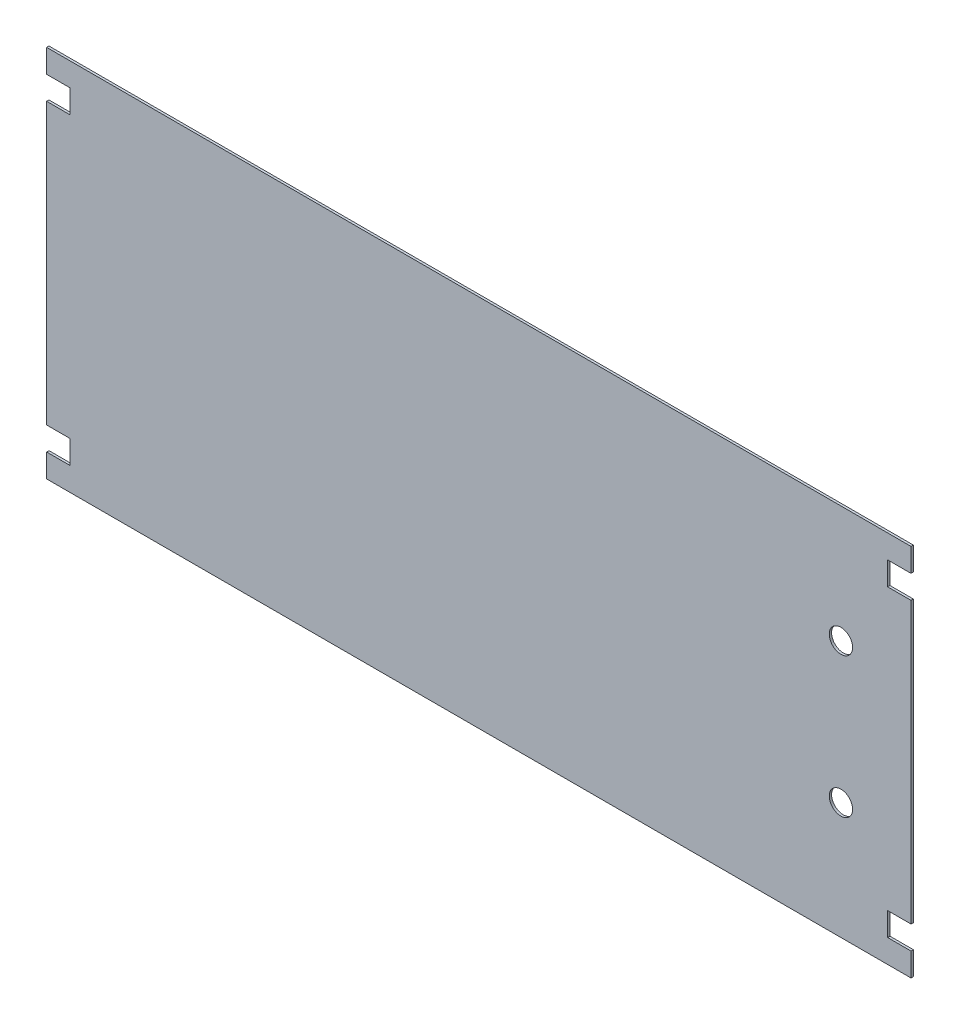
ISO-10303-21;
HEADER;
FILE_DESCRIPTION(('STEP AP214'),'2;1');
FILE_NAME('part.step','',(''),(''),'','','');
FILE_SCHEMA(('AUTOMOTIVE_DESIGN { 1 0 10303 214 1 1 1 1 }'));
ENDSEC;
DATA;
#1=APPLICATION_CONTEXT('core data for automotive mechanical design processes');
#2=APPLICATION_PROTOCOL_DEFINITION('international standard','automotive_design',2000,#1);
#3=PRODUCT_CONTEXT('',#1,'mechanical');
#4=PRODUCT('Part','Part','',(#3));
#5=PRODUCT_RELATED_PRODUCT_CATEGORY('part','',(#4));
#6=PRODUCT_DEFINITION_FORMATION('','',#4);
#7=PRODUCT_DEFINITION_CONTEXT('part definition',#1,'design');
#8=PRODUCT_DEFINITION('design','',#6,#7);
#9=PRODUCT_DEFINITION_SHAPE('','',#8);
#10=(LENGTH_UNIT() NAMED_UNIT(*) SI_UNIT(.MILLI.,.METRE.));
#11=(NAMED_UNIT(*) PLANE_ANGLE_UNIT() SI_UNIT($,.RADIAN.));
#12=(NAMED_UNIT(*) SI_UNIT($,.STERADIAN.) SOLID_ANGLE_UNIT());
#13=UNCERTAINTY_MEASURE_WITH_UNIT(LENGTH_MEASURE(1.E-05),#10,'distance_accuracy_value','');
#14=(GEOMETRIC_REPRESENTATION_CONTEXT(3) GLOBAL_UNCERTAINTY_ASSIGNED_CONTEXT((#13)) GLOBAL_UNIT_ASSIGNED_CONTEXT((#10,
#11,#12)) REPRESENTATION_CONTEXT('',''));
#15=CARTESIAN_POINT('',(0.,0.,0.));
#16=DIRECTION('',(0.,0.,1.));
#17=DIRECTION('',(1.,0.,0.));
#18=AXIS2_PLACEMENT_3D('',#15,#16,#17);
#19=CARTESIAN_POINT('',(0.,0.,1.));
#20=DIRECTION('',(1.,0.,0.));
#21=DIRECTION('',(0.,0.,-1.));
#22=AXIS2_PLACEMENT_3D('',#19,#20,#21);
#23=PLANE('',#22);
#24=DIRECTION('',(0.,-1.,0.));
#25=VECTOR('',#24,1.);
#26=CARTESIAN_POINT('',(0.,0.,0.));
#27=LINE('',#26,#25);
#28=CARTESIAN_POINT('',(0.,140.,0.));
#29=VERTEX_POINT('',#28);
#30=CARTESIAN_POINT('',(0.,20.,0.));
#31=VERTEX_POINT('',#30);
#32=EDGE_CURVE('E317',#29,#31,#27,.T.);
#33=ORIENTED_EDGE('',*,*,#32,.T.);
#34=DIRECTION('',(0.,0.,1.));
#35=VECTOR('',#34,1.);
#36=CARTESIAN_POINT('',(1.36167772214882E-12,20.,-0.000999999999999916));
#37=LINE('',#36,#35);
#38=CARTESIAN_POINT('',(1.36167772214882E-12,20.,1.));
#39=VERTEX_POINT('',#38);
#40=EDGE_CURVE('E272',#31,#39,#37,.T.);
#41=ORIENTED_EDGE('',*,*,#40,.T.);
#42=DIRECTION('',(0.,-1.,0.));
#43=VECTOR('',#42,1.);
#44=CARTESIAN_POINT('',(0.,0.,1.));
#45=LINE('',#44,#43);
#46=CARTESIAN_POINT('',(0.,140.,1.));
#47=VERTEX_POINT('',#46);
#48=EDGE_CURVE('E310',#47,#39,#45,.T.);
#49=ORIENTED_EDGE('',*,*,#48,.F.);
#50=DIRECTION('',(0.,0.,1.));
#51=VECTOR('',#50,1.);
#52=CARTESIAN_POINT('',(0.,140.,-0.000999999999999916));
#53=LINE('',#52,#51);
#54=EDGE_CURVE('E293',#29,#47,#53,.T.);
#55=ORIENTED_EDGE('',*,*,#54,.F.);
#56=EDGE_LOOP('',(#33,#41,#49,#55));
#57=FACE_BOUND('',#56,.T.);
#58=ADVANCED_FACE('F36',(#57),#23,.F.);
#59=CARTESIAN_POINT('',(0.,160.,0.));
#60=VERTEX_POINT('',#59);
#61=CARTESIAN_POINT('',(0.,150.,0.));
#62=VERTEX_POINT('',#61);
#63=EDGE_CURVE('E315',#60,#62,#27,.T.);
#64=ORIENTED_EDGE('',*,*,#63,.T.);
#65=DIRECTION('',(0.,0.,1.));
#66=VECTOR('',#65,1.);
#67=CARTESIAN_POINT('',(0.,150.,-0.000999999999999916));
#68=LINE('',#67,#66);
#69=CARTESIAN_POINT('',(0.,150.,1.));
#70=VERTEX_POINT('',#69);
#71=EDGE_CURVE('E294',#62,#70,#68,.T.);
#72=ORIENTED_EDGE('',*,*,#71,.T.);
#73=CARTESIAN_POINT('',(0.,160.,1.));
#74=VERTEX_POINT('',#73);
#75=EDGE_CURVE('E306',#74,#70,#45,.T.);
#76=ORIENTED_EDGE('',*,*,#75,.F.);
#77=DIRECTION('',(0.,0.,-1.));
#78=VECTOR('',#77,1.);
#79=CARTESIAN_POINT('',(0.,160.,1.));
#80=LINE('',#79,#78);
#81=EDGE_CURVE('E212',#74,#60,#80,.T.);
#82=ORIENTED_EDGE('',*,*,#81,.T.);
#83=EDGE_LOOP('',(#64,#72,#76,#82));
#84=FACE_BOUND('',#83,.T.);
#85=ADVANCED_FACE('F358',(#84),#23,.F.);
#86=CARTESIAN_POINT('',(370.,0.,1.));
#87=DIRECTION('',(-1.,0.,0.));
#88=DIRECTION('',(0.,0.,1.));
#89=AXIS2_PLACEMENT_3D('',#86,#87,#88);
#90=PLANE('',#89);
#91=DIRECTION('',(0.,1.,0.));
#92=VECTOR('',#91,1.);
#93=CARTESIAN_POINT('',(370.,0.,1.));
#94=LINE('',#93,#92);
#95=CARTESIAN_POINT('',(370.000000000001,20.,1.));
#96=VERTEX_POINT('',#95);
#97=CARTESIAN_POINT('',(370.,140.,1.));
#98=VERTEX_POINT('',#97);
#99=EDGE_CURVE('E314',#96,#98,#94,.T.);
#100=ORIENTED_EDGE('',*,*,#99,.F.);
#101=DIRECTION('',(0.,0.,1.));
#102=VECTOR('',#101,1.);
#103=CARTESIAN_POINT('',(370.000000000001,20.,-0.000999999999999916));
#104=LINE('',#103,#102);
#105=CARTESIAN_POINT('',(370.,20.,0.));
#106=VERTEX_POINT('',#105);
#107=EDGE_CURVE('E200',#106,#96,#104,.T.);
#108=ORIENTED_EDGE('',*,*,#107,.F.);
#109=DIRECTION('',(0.,1.,0.));
#110=VECTOR('',#109,1.);
#111=CARTESIAN_POINT('',(370.,0.,0.));
#112=LINE('',#111,#110);
#113=CARTESIAN_POINT('',(370.,140.,0.));
#114=VERTEX_POINT('',#113);
#115=EDGE_CURVE('E192',#106,#114,#112,.T.);
#116=ORIENTED_EDGE('',*,*,#115,.T.);
#117=DIRECTION('',(0.,0.,1.));
#118=VECTOR('',#117,1.);
#119=CARTESIAN_POINT('',(370.,140.,-0.000999999999999916));
#120=LINE('',#119,#118);
#121=EDGE_CURVE('E173',#114,#98,#120,.T.);
#122=ORIENTED_EDGE('',*,*,#121,.T.);
#123=EDGE_LOOP('',(#100,#108,#116,#122));
#124=FACE_BOUND('',#123,.T.);
#125=ADVANCED_FACE('F199',(#124),#90,.F.);
#126=CARTESIAN_POINT('',(370.,150.,1.));
#127=VERTEX_POINT('',#126);
#128=CARTESIAN_POINT('',(370.,160.,1.));
#129=VERTEX_POINT('',#128);
#130=EDGE_CURVE('E312',#127,#129,#94,.T.);
#131=ORIENTED_EDGE('',*,*,#130,.F.);
#132=DIRECTION('',(0.,0.,1.));
#133=VECTOR('',#132,1.);
#134=CARTESIAN_POINT('',(370.,150.,-0.000999999999999916));
#135=LINE('',#134,#133);
#136=CARTESIAN_POINT('',(370.,150.,0.));
#137=VERTEX_POINT('',#136);
#138=EDGE_CURVE('E184',#137,#127,#135,.T.);
#139=ORIENTED_EDGE('',*,*,#138,.F.);
#140=CARTESIAN_POINT('',(370.,160.,0.));
#141=VERTEX_POINT('',#140);
#142=EDGE_CURVE('E202',#137,#141,#112,.T.);
#143=ORIENTED_EDGE('',*,*,#142,.T.);
#144=DIRECTION('',(0.,0.,-1.));
#145=VECTOR('',#144,1.);
#146=CARTESIAN_POINT('',(370.,160.,1.));
#147=LINE('',#146,#145);
#148=EDGE_CURVE('E215',#129,#141,#147,.T.);
#149=ORIENTED_EDGE('',*,*,#148,.F.);
#150=EDGE_LOOP('',(#131,#139,#143,#149));
#151=FACE_BOUND('',#150,.T.);
#152=ADVANCED_FACE('F366',(#151),#90,.F.);
#153=CARTESIAN_POINT('',(1.36290236894797E-12,9.99999999999998,1.));
#154=VERTEX_POINT('',#153);
#155=CARTESIAN_POINT('',(0.,0.,1.));
#156=VERTEX_POINT('',#155);
#157=EDGE_CURVE('E211',#154,#156,#45,.T.);
#158=ORIENTED_EDGE('',*,*,#157,.F.);
#159=DIRECTION('',(0.,0.,1.));
#160=VECTOR('',#159,1.);
#161=CARTESIAN_POINT('',(1.36290236894797E-12,9.99999999999998,-0.000999999999999916));
#162=LINE('',#161,#160);
#163=CARTESIAN_POINT('',(1.36290236894797E-12,9.99999999999998,0.));
#164=VERTEX_POINT('',#163);
#165=EDGE_CURVE('E275',#164,#154,#162,.T.);
#166=ORIENTED_EDGE('',*,*,#165,.F.);
#167=CARTESIAN_POINT('',(0.,0.,0.));
#168=VERTEX_POINT('',#167);
#169=EDGE_CURVE('E305',#164,#168,#27,.T.);
#170=ORIENTED_EDGE('',*,*,#169,.T.);
#171=DIRECTION('',(0.,0.,-1.));
#172=VECTOR('',#171,1.);
#173=CARTESIAN_POINT('',(0.,0.,1.));
#174=LINE('',#173,#172);
#175=EDGE_CURVE('E11',#156,#168,#174,.T.);
#176=ORIENTED_EDGE('',*,*,#175,.F.);
#177=EDGE_LOOP('',(#158,#166,#170,#176));
#178=FACE_BOUND('',#177,.T.);
#179=ADVANCED_FACE('F38',(#178),#23,.F.);
#180=CARTESIAN_POINT('',(0.,0.,1.));
#181=DIRECTION('',(0.,1.,0.));
#182=DIRECTION('',(0.,0.,1.));
#183=AXIS2_PLACEMENT_3D('',#180,#181,#182);
#184=PLANE('',#183);
#185=DIRECTION('',(1.,0.,0.));
#186=VECTOR('',#185,1.);
#187=CARTESIAN_POINT('',(0.,0.,0.));
#188=LINE('',#187,#186);
#189=CARTESIAN_POINT('',(370.,0.,0.));
#190=VERTEX_POINT('',#189);
#191=EDGE_CURVE('E206',#168,#190,#188,.T.);
#192=ORIENTED_EDGE('',*,*,#191,.T.);
#193=DIRECTION('',(0.,0.,-1.));
#194=VECTOR('',#193,1.);
#195=CARTESIAN_POINT('',(370.,0.,1.));
#196=LINE('',#195,#194);
#197=CARTESIAN_POINT('',(370.,0.,1.));
#198=VERTEX_POINT('',#197);
#199=EDGE_CURVE('E44',#198,#190,#196,.T.);
#200=ORIENTED_EDGE('',*,*,#199,.F.);
#201=DIRECTION('',(1.,0.,0.));
#202=VECTOR('',#201,1.);
#203=CARTESIAN_POINT('',(0.,0.,1.));
#204=LINE('',#203,#202);
#205=EDGE_CURVE('E309',#156,#198,#204,.T.);
#206=ORIENTED_EDGE('',*,*,#205,.F.);
#207=ORIENTED_EDGE('',*,*,#175,.T.);
#208=EDGE_LOOP('',(#192,#200,#206,#207));
#209=FACE_BOUND('',#208,.T.);
#210=ADVANCED_FACE('F418',(#209),#184,.F.);
#211=CARTESIAN_POINT('',(370.,9.99999999999998,0.));
#212=VERTEX_POINT('',#211);
#213=EDGE_CURVE('E201',#190,#212,#112,.T.);
#214=ORIENTED_EDGE('',*,*,#213,.T.);
#215=DIRECTION('',(0.,0.,1.));
#216=VECTOR('',#215,1.);
#217=CARTESIAN_POINT('',(370.000000000001,9.99999999999998,-0.000999999999999916));
#218=LINE('',#217,#216);
#219=CARTESIAN_POINT('',(370.000000000001,9.99999999999998,1.));
#220=VERTEX_POINT('',#219);
#221=EDGE_CURVE('E252',#212,#220,#218,.T.);
#222=ORIENTED_EDGE('',*,*,#221,.T.);
#223=EDGE_CURVE('E226',#198,#220,#94,.T.);
#224=ORIENTED_EDGE('',*,*,#223,.F.);
#225=ORIENTED_EDGE('',*,*,#199,.T.);
#226=EDGE_LOOP('',(#214,#222,#224,#225));
#227=FACE_BOUND('',#226,.T.);
#228=ADVANCED_FACE('F223',(#227),#90,.F.);
#229=CARTESIAN_POINT('',(0.,160.,1.));
#230=DIRECTION('',(0.,-1.,0.));
#231=DIRECTION('',(0.,0.,-1.));
#232=AXIS2_PLACEMENT_3D('',#229,#230,#231);
#233=PLANE('',#232);
#234=DIRECTION('',(-1.,0.,0.));
#235=VECTOR('',#234,1.);
#236=CARTESIAN_POINT('',(0.,160.,0.));
#237=LINE('',#236,#235);
#238=EDGE_CURVE('E205',#141,#60,#237,.T.);
#239=ORIENTED_EDGE('',*,*,#238,.T.);
#240=ORIENTED_EDGE('',*,*,#81,.F.);
#241=DIRECTION('',(-1.,0.,0.));
#242=VECTOR('',#241,1.);
#243=CARTESIAN_POINT('',(0.,160.,1.));
#244=LINE('',#243,#242);
#245=EDGE_CURVE('E216',#129,#74,#244,.T.);
#246=ORIENTED_EDGE('',*,*,#245,.F.);
#247=ORIENTED_EDGE('',*,*,#148,.T.);
#248=EDGE_LOOP('',(#239,#240,#246,#247));
#249=FACE_BOUND('',#248,.T.);
#250=ADVANCED_FACE('F354',(#249),#233,.F.);
#251=CARTESIAN_POINT('',(0.,0.,1.));
#252=DIRECTION('',(0.,0.,-1.));
#253=DIRECTION('',(-1.,0.,0.));
#254=AXIS2_PLACEMENT_3D('',#251,#252,#253);
#255=PLANE('',#254);
#256=CARTESIAN_POINT('',(340.000000000001,110.,1.));
#257=DIRECTION('',(0.,0.,1.));
#258=DIRECTION('',(1.,0.,0.));
#259=AXIS2_PLACEMENT_3D('',#256,#257,#258);
#260=CIRCLE('',#259,4.99999999999999);
#261=CARTESIAN_POINT('',(345.000000000001,110.,1.));
#262=VERTEX_POINT('',#261);
#263=EDGE_CURVE('E261',#262,#262,#260,.T.);
#264=ORIENTED_EDGE('',*,*,#263,.F.);
#265=EDGE_LOOP('',(#264));
#266=FACE_BOUND('',#265,.T.);
#267=CARTESIAN_POINT('',(340.000000000002,50.,1.));
#268=DIRECTION('',(0.,0.,1.));
#269=DIRECTION('',(1.,0.,0.));
#270=AXIS2_PLACEMENT_3D('',#267,#268,#269);
#271=CIRCLE('',#270,4.99999999999999);
#272=CARTESIAN_POINT('',(345.000000000002,50.,1.));
#273=VERTEX_POINT('',#272);
#274=EDGE_CURVE('E383',#273,#273,#271,.T.);
#275=ORIENTED_EDGE('',*,*,#274,.F.);
#276=EDGE_LOOP('',(#275));
#277=FACE_BOUND('',#276,.T.);
#278=ORIENTED_EDGE('',*,*,#48,.T.);
#279=DIRECTION('',(-1.,0.,0.));
#280=VECTOR('',#279,1.);
#281=CARTESIAN_POINT('',(1.36167772214882E-12,20.,1.));
#282=LINE('',#281,#280);
#283=CARTESIAN_POINT('',(10.0000000000014,20.,1.));
#284=VERTEX_POINT('',#283);
#285=EDGE_CURVE('E266',#284,#39,#282,.T.);
#286=ORIENTED_EDGE('',*,*,#285,.F.);
#287=DIRECTION('',(0.,1.,0.));
#288=VECTOR('',#287,1.);
#289=CARTESIAN_POINT('',(10.0000000000014,20.,1.));
#290=LINE('',#289,#288);
#291=CARTESIAN_POINT('',(10.0000000000014,9.99999999999998,1.));
#292=VERTEX_POINT('',#291);
#293=EDGE_CURVE('E270',#292,#284,#290,.T.);
#294=ORIENTED_EDGE('',*,*,#293,.F.);
#295=DIRECTION('',(1.,0.,0.));
#296=VECTOR('',#295,1.);
#297=CARTESIAN_POINT('',(1.36290236894797E-12,9.99999999999998,1.));
#298=LINE('',#297,#296);
#299=EDGE_CURVE('E268',#154,#292,#298,.T.);
#300=ORIENTED_EDGE('',*,*,#299,.F.);
#301=ORIENTED_EDGE('',*,*,#157,.T.);
#302=ORIENTED_EDGE('',*,*,#205,.T.);
#303=ORIENTED_EDGE('',*,*,#223,.T.);
#304=DIRECTION('',(1.,0.,0.));
#305=VECTOR('',#304,1.);
#306=CARTESIAN_POINT('',(360.000000000001,9.99999999999998,1.));
#307=LINE('',#306,#305);
#308=CARTESIAN_POINT('',(360.000000000001,9.99999999999998,1.));
#309=VERTEX_POINT('',#308);
#310=EDGE_CURVE('E248',#309,#220,#307,.T.);
#311=ORIENTED_EDGE('',*,*,#310,.F.);
#312=DIRECTION('',(0.,-1.,0.));
#313=VECTOR('',#312,1.);
#314=CARTESIAN_POINT('',(360.000000000001,20.,1.));
#315=LINE('',#314,#313);
#316=CARTESIAN_POINT('',(360.000000000001,20.,1.));
#317=VERTEX_POINT('',#316);
#318=EDGE_CURVE('E246',#317,#309,#315,.T.);
#319=ORIENTED_EDGE('',*,*,#318,.F.);
#320=DIRECTION('',(-1.,0.,0.));
#321=VECTOR('',#320,1.);
#322=CARTESIAN_POINT('',(360.000000000001,20.,1.));
#323=LINE('',#322,#321);
#324=EDGE_CURVE('E238',#96,#317,#323,.T.);
#325=ORIENTED_EDGE('',*,*,#324,.F.);
#326=ORIENTED_EDGE('',*,*,#99,.T.);
#327=DIRECTION('',(1.,0.,0.));
#328=VECTOR('',#327,1.);
#329=CARTESIAN_POINT('',(360.,140.,1.));
#330=LINE('',#329,#328);
#331=CARTESIAN_POINT('',(360.,140.,1.));
#332=VERTEX_POINT('',#331);
#333=EDGE_CURVE('E179',#332,#98,#330,.T.);
#334=ORIENTED_EDGE('',*,*,#333,.F.);
#335=DIRECTION('',(0.,-1.,0.));
#336=VECTOR('',#335,1.);
#337=CARTESIAN_POINT('',(360.,150.,1.));
#338=LINE('',#337,#336);
#339=CARTESIAN_POINT('',(360.,150.,1.));
#340=VERTEX_POINT('',#339);
#341=EDGE_CURVE('E376',#340,#332,#338,.T.);
#342=ORIENTED_EDGE('',*,*,#341,.F.);
#343=DIRECTION('',(-1.,0.,0.));
#344=VECTOR('',#343,1.);
#345=CARTESIAN_POINT('',(360.,150.,1.));
#346=LINE('',#345,#344);
#347=EDGE_CURVE('E363',#127,#340,#346,.T.);
#348=ORIENTED_EDGE('',*,*,#347,.F.);
#349=ORIENTED_EDGE('',*,*,#130,.T.);
#350=ORIENTED_EDGE('',*,*,#245,.T.);
#351=ORIENTED_EDGE('',*,*,#75,.T.);
#352=DIRECTION('',(-1.,0.,0.));
#353=VECTOR('',#352,1.);
#354=CARTESIAN_POINT('',(0.,150.,1.));
#355=LINE('',#354,#353);
#356=CARTESIAN_POINT('',(10.,150.,1.));
#357=VERTEX_POINT('',#356);
#358=EDGE_CURVE('E291',#357,#70,#355,.T.);
#359=ORIENTED_EDGE('',*,*,#358,.F.);
#360=DIRECTION('',(0.,1.,0.));
#361=VECTOR('',#360,1.);
#362=CARTESIAN_POINT('',(10.,150.,1.));
#363=LINE('',#362,#361);
#364=CARTESIAN_POINT('',(10.,140.,1.));
#365=VERTEX_POINT('',#364);
#366=EDGE_CURVE('E288',#365,#357,#363,.T.);
#367=ORIENTED_EDGE('',*,*,#366,.F.);
#368=DIRECTION('',(1.,0.,0.));
#369=VECTOR('',#368,1.);
#370=CARTESIAN_POINT('',(0.,140.,1.));
#371=LINE('',#370,#369);
#372=EDGE_CURVE('E285',#47,#365,#371,.T.);
#373=ORIENTED_EDGE('',*,*,#372,.F.);
#374=EDGE_LOOP('',(#278,#286,#294,#300,#301,#302,#303,#311,#319,#325,#326,#334,#342,#348,#349,
#350,#351,#359,#367,#373));
#375=FACE_BOUND('',#374,.T.);
#376=ADVANCED_FACE('F330',(#266,#277,#375),#255,.F.);
#377=CARTESIAN_POINT('',(0.,0.,0.));
#378=DIRECTION('',(0.,0.,-1.));
#379=DIRECTION('',(-1.,0.,0.));
#380=AXIS2_PLACEMENT_3D('',#377,#378,#379);
#381=PLANE('',#380);
#382=CARTESIAN_POINT('',(340.000000000001,110.,0.));
#383=DIRECTION('',(0.,0.,-1.));
#384=DIRECTION('',(-1.,0.,0.));
#385=AXIS2_PLACEMENT_3D('',#382,#383,#384);
#386=CIRCLE('',#385,4.99999999999999);
#387=CARTESIAN_POINT('',(335.000000000001,110.,0.));
#388=VERTEX_POINT('',#387);
#389=EDGE_CURVE('E386',#388,#388,#386,.F.);
#390=ORIENTED_EDGE('',*,*,#389,.T.);
#391=EDGE_LOOP('',(#390));
#392=FACE_BOUND('',#391,.T.);
#393=CARTESIAN_POINT('',(340.000000000002,50.,0.));
#394=DIRECTION('',(0.,0.,-1.));
#395=DIRECTION('',(-1.,0.,0.));
#396=AXIS2_PLACEMENT_3D('',#393,#394,#395);
#397=CIRCLE('',#396,4.99999999999999);
#398=CARTESIAN_POINT('',(335.000000000002,50.,0.));
#399=VERTEX_POINT('',#398);
#400=EDGE_CURVE('E380',#399,#399,#397,.F.);
#401=ORIENTED_EDGE('',*,*,#400,.T.);
#402=EDGE_LOOP('',(#401));
#403=FACE_BOUND('',#402,.T.);
#404=DIRECTION('',(-1.,0.,0.));
#405=VECTOR('',#404,1.);
#406=CARTESIAN_POINT('',(1.36167772214882E-12,20.,0.));
#407=LINE('',#406,#405);
#408=CARTESIAN_POINT('',(10.0000000000014,20.,0.));
#409=VERTEX_POINT('',#408);
#410=EDGE_CURVE('E264',#409,#31,#407,.T.);
#411=ORIENTED_EDGE('',*,*,#410,.T.);
#412=ORIENTED_EDGE('',*,*,#32,.F.);
#413=DIRECTION('',(1.,0.,0.));
#414=VECTOR('',#413,1.);
#415=CARTESIAN_POINT('',(0.,140.,0.));
#416=LINE('',#415,#414);
#417=CARTESIAN_POINT('',(10.,140.,0.));
#418=VERTEX_POINT('',#417);
#419=EDGE_CURVE('E297',#29,#418,#416,.T.);
#420=ORIENTED_EDGE('',*,*,#419,.T.);
#421=DIRECTION('',(0.,1.,0.));
#422=VECTOR('',#421,1.);
#423=CARTESIAN_POINT('',(10.,150.,0.));
#424=LINE('',#423,#422);
#425=CARTESIAN_POINT('',(10.,150.,0.));
#426=VERTEX_POINT('',#425);
#427=EDGE_CURVE('E279',#418,#426,#424,.T.);
#428=ORIENTED_EDGE('',*,*,#427,.T.);
#429=DIRECTION('',(-1.,0.,0.));
#430=VECTOR('',#429,1.);
#431=CARTESIAN_POINT('',(0.,150.,0.));
#432=LINE('',#431,#430);
#433=EDGE_CURVE('E282',#426,#62,#432,.T.);
#434=ORIENTED_EDGE('',*,*,#433,.T.);
#435=ORIENTED_EDGE('',*,*,#63,.F.);
#436=ORIENTED_EDGE('',*,*,#238,.F.);
#437=ORIENTED_EDGE('',*,*,#142,.F.);
#438=DIRECTION('',(-1.,0.,0.));
#439=VECTOR('',#438,1.);
#440=CARTESIAN_POINT('',(360.,150.,0.));
#441=LINE('',#440,#439);
#442=CARTESIAN_POINT('',(360.,150.,0.));
#443=VERTEX_POINT('',#442);
#444=EDGE_CURVE('E195',#137,#443,#441,.T.);
#445=ORIENTED_EDGE('',*,*,#444,.T.);
#446=DIRECTION('',(0.,-1.,0.));
#447=VECTOR('',#446,1.);
#448=CARTESIAN_POINT('',(360.,150.,0.));
#449=LINE('',#448,#447);
#450=CARTESIAN_POINT('',(360.,140.,0.));
#451=VERTEX_POINT('',#450);
#452=EDGE_CURVE('E194',#443,#451,#449,.T.);
#453=ORIENTED_EDGE('',*,*,#452,.T.);
#454=DIRECTION('',(1.,0.,0.));
#455=VECTOR('',#454,1.);
#456=CARTESIAN_POINT('',(360.,140.,0.));
#457=LINE('',#456,#455);
#458=EDGE_CURVE('E176',#451,#114,#457,.T.);
#459=ORIENTED_EDGE('',*,*,#458,.T.);
#460=ORIENTED_EDGE('',*,*,#115,.F.);
#461=DIRECTION('',(-1.,0.,0.));
#462=VECTOR('',#461,1.);
#463=CARTESIAN_POINT('',(360.000000000001,20.,0.));
#464=LINE('',#463,#462);
#465=CARTESIAN_POINT('',(360.000000000001,20.,0.));
#466=VERTEX_POINT('',#465);
#467=EDGE_CURVE('E235',#106,#466,#464,.T.);
#468=ORIENTED_EDGE('',*,*,#467,.T.);
#469=DIRECTION('',(0.,-1.,0.));
#470=VECTOR('',#469,1.);
#471=CARTESIAN_POINT('',(360.000000000001,20.,0.));
#472=LINE('',#471,#470);
#473=CARTESIAN_POINT('',(360.000000000001,9.99999999999998,0.));
#474=VERTEX_POINT('',#473);
#475=EDGE_CURVE('E196',#466,#474,#472,.T.);
#476=ORIENTED_EDGE('',*,*,#475,.T.);
#477=DIRECTION('',(1.,0.,0.));
#478=VECTOR('',#477,1.);
#479=CARTESIAN_POINT('',(360.000000000001,9.99999999999998,0.));
#480=LINE('',#479,#478);
#481=EDGE_CURVE('E233',#474,#212,#480,.T.);
#482=ORIENTED_EDGE('',*,*,#481,.T.);
#483=ORIENTED_EDGE('',*,*,#213,.F.);
#484=ORIENTED_EDGE('',*,*,#191,.F.);
#485=ORIENTED_EDGE('',*,*,#169,.F.);
#486=DIRECTION('',(1.,0.,0.));
#487=VECTOR('',#486,1.);
#488=CARTESIAN_POINT('',(1.36290236894797E-12,9.99999999999998,0.));
#489=LINE('',#488,#487);
#490=CARTESIAN_POINT('',(10.0000000000014,9.99999999999998,0.));
#491=VERTEX_POINT('',#490);
#492=EDGE_CURVE('E257',#164,#491,#489,.T.);
#493=ORIENTED_EDGE('',*,*,#492,.T.);
#494=DIRECTION('',(0.,1.,0.));
#495=VECTOR('',#494,1.);
#496=CARTESIAN_POINT('',(10.0000000000014,20.,0.));
#497=LINE('',#496,#495);
#498=EDGE_CURVE('E260',#491,#409,#497,.T.);
#499=ORIENTED_EDGE('',*,*,#498,.T.);
#500=EDGE_LOOP('',(#411,#412,#420,#428,#434,#435,#436,#437,#445,#453,#459,#460,#468,#476,#482,
#483,#484,#485,#493,#499));
#501=FACE_BOUND('',#500,.T.);
#502=ADVANCED_FACE('F190',(#392,#403,#501),#381,.T.);
#503=CARTESIAN_POINT('',(0.,150.,-0.000999999999999916));
#504=DIRECTION('',(0.,1.,0.));
#505=DIRECTION('',(0.,0.,1.));
#506=AXIS2_PLACEMENT_3D('',#503,#504,#505);
#507=PLANE('',#506);
#508=DIRECTION('',(0.,0.,1.));
#509=VECTOR('',#508,1.);
#510=CARTESIAN_POINT('',(10.,150.,-0.000999999999999916));
#511=LINE('',#510,#509);
#512=EDGE_CURVE('E298',#426,#357,#511,.T.);
#513=ORIENTED_EDGE('',*,*,#512,.T.);
#514=ORIENTED_EDGE('',*,*,#358,.T.);
#515=ORIENTED_EDGE('',*,*,#71,.F.);
#516=ORIENTED_EDGE('',*,*,#433,.F.);
#517=EDGE_LOOP('',(#513,#514,#515,#516));
#518=FACE_BOUND('',#517,.T.);
#519=ADVANCED_FACE('F349',(#518),#507,.F.);
#520=CARTESIAN_POINT('',(10.,150.,-0.000999999999999916));
#521=DIRECTION('',(1.,0.,0.));
#522=DIRECTION('',(0.,0.,-1.));
#523=AXIS2_PLACEMENT_3D('',#520,#521,#522);
#524=PLANE('',#523);
#525=DIRECTION('',(0.,0.,1.));
#526=VECTOR('',#525,1.);
#527=CARTESIAN_POINT('',(10.,140.,-0.000999999999999916));
#528=LINE('',#527,#526);
#529=EDGE_CURVE('E300',#418,#365,#528,.T.);
#530=ORIENTED_EDGE('',*,*,#529,.T.);
#531=ORIENTED_EDGE('',*,*,#366,.T.);
#532=ORIENTED_EDGE('',*,*,#512,.F.);
#533=ORIENTED_EDGE('',*,*,#427,.F.);
#534=EDGE_LOOP('',(#530,#531,#532,#533));
#535=FACE_BOUND('',#534,.T.);
#536=ADVANCED_FACE('F346',(#535),#524,.F.);
#537=CARTESIAN_POINT('',(0.,140.,-0.000999999999999916));
#538=DIRECTION('',(0.,-1.,0.));
#539=DIRECTION('',(0.,0.,-1.));
#540=AXIS2_PLACEMENT_3D('',#537,#538,#539);
#541=PLANE('',#540);
#542=ORIENTED_EDGE('',*,*,#54,.T.);
#543=ORIENTED_EDGE('',*,*,#372,.T.);
#544=ORIENTED_EDGE('',*,*,#529,.F.);
#545=ORIENTED_EDGE('',*,*,#419,.F.);
#546=EDGE_LOOP('',(#542,#543,#544,#545));
#547=FACE_BOUND('',#546,.T.);
#548=ADVANCED_FACE('F343',(#547),#541,.F.);
#549=CARTESIAN_POINT('',(360.,150.,-0.000999999999999916));
#550=DIRECTION('',(0.,1.,0.));
#551=DIRECTION('',(0.,0.,1.));
#552=AXIS2_PLACEMENT_3D('',#549,#550,#551);
#553=PLANE('',#552);
#554=ORIENTED_EDGE('',*,*,#138,.T.);
#555=ORIENTED_EDGE('',*,*,#347,.T.);
#556=DIRECTION('',(0.,0.,1.));
#557=VECTOR('',#556,1.);
#558=CARTESIAN_POINT('',(360.,150.,-0.000999999999999916));
#559=LINE('',#558,#557);
#560=EDGE_CURVE('E372',#443,#340,#559,.T.);
#561=ORIENTED_EDGE('',*,*,#560,.F.);
#562=ORIENTED_EDGE('',*,*,#444,.F.);
#563=EDGE_LOOP('',(#554,#555,#561,#562));
#564=FACE_BOUND('',#563,.T.);
#565=ADVANCED_FACE('F440',(#564),#553,.F.);
#566=CARTESIAN_POINT('',(360.,140.,-0.000999999999999916));
#567=DIRECTION('',(0.,-1.,0.));
#568=DIRECTION('',(0.,0.,-1.));
#569=AXIS2_PLACEMENT_3D('',#566,#567,#568);
#570=PLANE('',#569);
#571=DIRECTION('',(0.,0.,1.));
#572=VECTOR('',#571,1.);
#573=CARTESIAN_POINT('',(360.,140.,-0.000999999999999916));
#574=LINE('',#573,#572);
#575=EDGE_CURVE('E185',#451,#332,#574,.T.);
#576=ORIENTED_EDGE('',*,*,#575,.T.);
#577=ORIENTED_EDGE('',*,*,#333,.T.);
#578=ORIENTED_EDGE('',*,*,#121,.F.);
#579=ORIENTED_EDGE('',*,*,#458,.F.);
#580=EDGE_LOOP('',(#576,#577,#578,#579));
#581=FACE_BOUND('',#580,.T.);
#582=ADVANCED_FACE('F175',(#581),#570,.F.);
#583=CARTESIAN_POINT('',(360.,150.,-0.000999999999999916));
#584=DIRECTION('',(-1.,0.,0.));
#585=DIRECTION('',(0.,0.,1.));
#586=AXIS2_PLACEMENT_3D('',#583,#584,#585);
#587=PLANE('',#586);
#588=ORIENTED_EDGE('',*,*,#560,.T.);
#589=ORIENTED_EDGE('',*,*,#341,.T.);
#590=ORIENTED_EDGE('',*,*,#575,.F.);
#591=ORIENTED_EDGE('',*,*,#452,.F.);
#592=EDGE_LOOP('',(#588,#589,#590,#591));
#593=FACE_BOUND('',#592,.T.);
#594=ADVANCED_FACE('F455',(#593),#587,.F.);
#595=CARTESIAN_POINT('',(360.000000000001,20.,-0.000999999999999916));
#596=DIRECTION('',(0.,1.,0.));
#597=DIRECTION('',(0.,0.,1.));
#598=AXIS2_PLACEMENT_3D('',#595,#596,#597);
#599=PLANE('',#598);
#600=ORIENTED_EDGE('',*,*,#107,.T.);
#601=ORIENTED_EDGE('',*,*,#324,.T.);
#602=DIRECTION('',(0.,0.,1.));
#603=VECTOR('',#602,1.);
#604=CARTESIAN_POINT('',(360.000000000001,20.,-0.000999999999999916));
#605=LINE('',#604,#603);
#606=EDGE_CURVE('E250',#466,#317,#605,.T.);
#607=ORIENTED_EDGE('',*,*,#606,.F.);
#608=ORIENTED_EDGE('',*,*,#467,.F.);
#609=EDGE_LOOP('',(#600,#601,#607,#608));
#610=FACE_BOUND('',#609,.T.);
#611=ADVANCED_FACE('F451',(#610),#599,.F.);
#612=CARTESIAN_POINT('',(360.000000000001,9.99999999999998,-0.000999999999999916));
#613=DIRECTION('',(0.,-1.,0.));
#614=DIRECTION('',(0.,0.,-1.));
#615=AXIS2_PLACEMENT_3D('',#612,#613,#614);
#616=PLANE('',#615);
#617=DIRECTION('',(0.,0.,1.));
#618=VECTOR('',#617,1.);
#619=CARTESIAN_POINT('',(360.000000000001,9.99999999999998,-0.000999999999999916));
#620=LINE('',#619,#618);
#621=EDGE_CURVE('E59',#474,#309,#620,.T.);
#622=ORIENTED_EDGE('',*,*,#621,.T.);
#623=ORIENTED_EDGE('',*,*,#310,.T.);
#624=ORIENTED_EDGE('',*,*,#221,.F.);
#625=ORIENTED_EDGE('',*,*,#481,.F.);
#626=EDGE_LOOP('',(#622,#623,#624,#625));
#627=FACE_BOUND('',#626,.T.);
#628=ADVANCED_FACE('F454',(#627),#616,.F.);
#629=CARTESIAN_POINT('',(360.000000000001,20.,-0.000999999999999916));
#630=DIRECTION('',(-1.,0.,0.));
#631=DIRECTION('',(0.,0.,1.));
#632=AXIS2_PLACEMENT_3D('',#629,#630,#631);
#633=PLANE('',#632);
#634=ORIENTED_EDGE('',*,*,#606,.T.);
#635=ORIENTED_EDGE('',*,*,#318,.T.);
#636=ORIENTED_EDGE('',*,*,#621,.F.);
#637=ORIENTED_EDGE('',*,*,#475,.F.);
#638=EDGE_LOOP('',(#634,#635,#636,#637));
#639=FACE_BOUND('',#638,.T.);
#640=ADVANCED_FACE('F446',(#639),#633,.F.);
#641=CARTESIAN_POINT('',(1.36167772214882E-12,20.,-0.000999999999999916));
#642=DIRECTION('',(0.,1.,0.));
#643=DIRECTION('',(0.,0.,1.));
#644=AXIS2_PLACEMENT_3D('',#641,#642,#643);
#645=PLANE('',#644);
#646=DIRECTION('',(0.,0.,1.));
#647=VECTOR('',#646,1.);
#648=CARTESIAN_POINT('',(10.0000000000014,20.,-0.000999999999999916));
#649=LINE('',#648,#647);
#650=EDGE_CURVE('E236',#409,#284,#649,.T.);
#651=ORIENTED_EDGE('',*,*,#650,.T.);
#652=ORIENTED_EDGE('',*,*,#285,.T.);
#653=ORIENTED_EDGE('',*,*,#40,.F.);
#654=ORIENTED_EDGE('',*,*,#410,.F.);
#655=EDGE_LOOP('',(#651,#652,#653,#654));
#656=FACE_BOUND('',#655,.T.);
#657=ADVANCED_FACE('F339',(#656),#645,.F.);
#658=CARTESIAN_POINT('',(10.0000000000014,20.,-0.000999999999999916));
#659=DIRECTION('',(1.,0.,0.));
#660=DIRECTION('',(0.,0.,-1.));
#661=AXIS2_PLACEMENT_3D('',#658,#659,#660);
#662=PLANE('',#661);
#663=DIRECTION('',(0.,0.,1.));
#664=VECTOR('',#663,1.);
#665=CARTESIAN_POINT('',(10.0000000000014,9.99999999999998,-0.000999999999999916));
#666=LINE('',#665,#664);
#667=EDGE_CURVE('E51',#491,#292,#666,.T.);
#668=ORIENTED_EDGE('',*,*,#667,.T.);
#669=ORIENTED_EDGE('',*,*,#293,.T.);
#670=ORIENTED_EDGE('',*,*,#650,.F.);
#671=ORIENTED_EDGE('',*,*,#498,.F.);
#672=EDGE_LOOP('',(#668,#669,#670,#671));
#673=FACE_BOUND('',#672,.T.);
#674=ADVANCED_FACE('F409',(#673),#662,.F.);
#675=CARTESIAN_POINT('',(1.36290236894797E-12,9.99999999999998,-0.000999999999999916));
#676=DIRECTION('',(0.,-1.,0.));
#677=DIRECTION('',(0.,0.,-1.));
#678=AXIS2_PLACEMENT_3D('',#675,#676,#677);
#679=PLANE('',#678);
#680=ORIENTED_EDGE('',*,*,#165,.T.);
#681=ORIENTED_EDGE('',*,*,#299,.T.);
#682=ORIENTED_EDGE('',*,*,#667,.F.);
#683=ORIENTED_EDGE('',*,*,#492,.F.);
#684=EDGE_LOOP('',(#680,#681,#682,#683));
#685=FACE_BOUND('',#684,.T.);
#686=ADVANCED_FACE('F325',(#685),#679,.F.);
#687=CARTESIAN_POINT('',(340.000000000002,50.,-0.000999999999999916));
#688=DIRECTION('',(0.,0.,1.));
#689=DIRECTION('',(1.,0.,0.));
#690=AXIS2_PLACEMENT_3D('',#687,#688,#689);
#691=CYLINDRICAL_SURFACE('',#690,4.99999999999999);
#692=ORIENTED_EDGE('',*,*,#400,.F.);
#693=EDGE_LOOP('',(#692));
#694=FACE_BOUND('',#693,.T.);
#695=ORIENTED_EDGE('',*,*,#274,.T.);
#696=EDGE_LOOP('',(#695));
#697=FACE_BOUND('',#696,.T.);
#698=ADVANCED_FACE('F399',(#694,#697),#691,.F.);
#699=CARTESIAN_POINT('',(340.000000000001,110.,-0.000999999999999916));
#700=DIRECTION('',(0.,0.,1.));
#701=DIRECTION('',(1.,0.,0.));
#702=AXIS2_PLACEMENT_3D('',#699,#700,#701);
#703=CYLINDRICAL_SURFACE('',#702,4.99999999999999);
#704=ORIENTED_EDGE('',*,*,#389,.F.);
#705=EDGE_LOOP('',(#704));
#706=FACE_BOUND('',#705,.T.);
#707=ORIENTED_EDGE('',*,*,#263,.T.);
#708=EDGE_LOOP('',(#707));
#709=FACE_BOUND('',#708,.T.);
#710=ADVANCED_FACE('F392',(#706,#709),#703,.F.);
#711=CLOSED_SHELL('',(#58,#85,#125,#152,#179,#210,#228,#250,#376,#502,#519,#536,#548,#565,#582,
#594,#611,#628,#640,#657,#674,#686,#698,#710));
#712=MANIFOLD_SOLID_BREP('B2',#711);
#713=ADVANCED_BREP_SHAPE_REPRESENTATION('',(#18,#712),#14);
#714=SHAPE_DEFINITION_REPRESENTATION(#9,#713);
ENDSEC;
END-ISO-10303-21;
